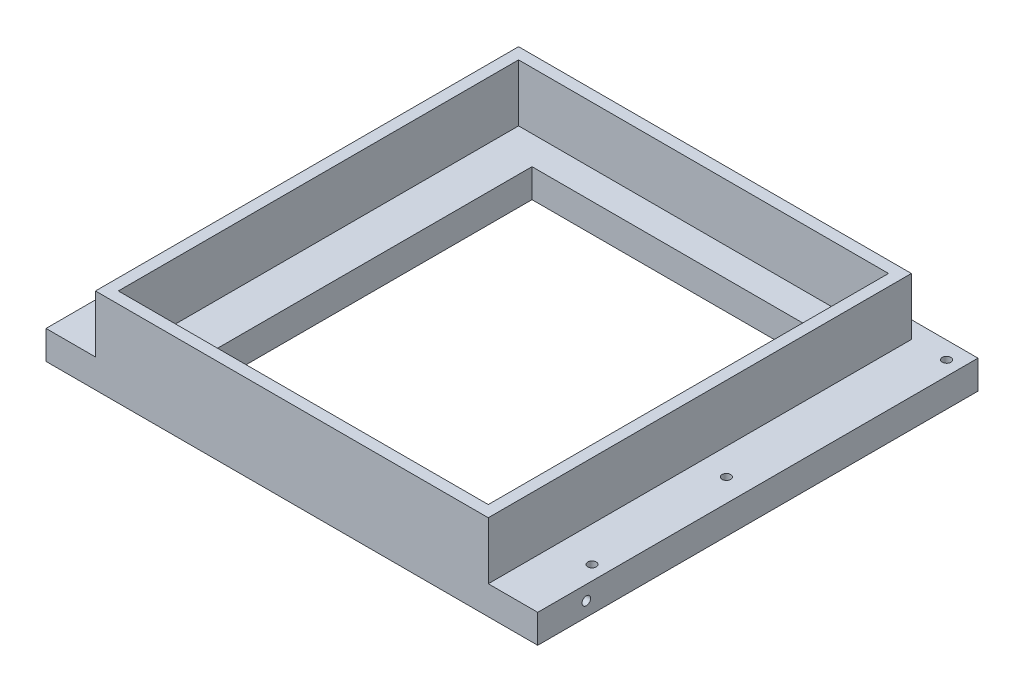
ISO-10303-21;
HEADER;
FILE_DESCRIPTION(('STEP AP214'),'2;1');
FILE_NAME('part.step','',(''),(''),'','','');
FILE_SCHEMA(('AUTOMOTIVE_DESIGN { 1 0 10303 214 1 1 1 1 }'));
ENDSEC;
DATA;
#1=APPLICATION_CONTEXT('core data for automotive mechanical design processes');
#2=APPLICATION_PROTOCOL_DEFINITION('international standard','automotive_design',2000,#1);
#3=PRODUCT_CONTEXT('',#1,'mechanical');
#4=PRODUCT('Part','Part','',(#3));
#5=PRODUCT_RELATED_PRODUCT_CATEGORY('part','',(#4));
#6=PRODUCT_DEFINITION_FORMATION('','',#4);
#7=PRODUCT_DEFINITION_CONTEXT('part definition',#1,'design');
#8=PRODUCT_DEFINITION('design','',#6,#7);
#9=PRODUCT_DEFINITION_SHAPE('','',#8);
#10=(LENGTH_UNIT() NAMED_UNIT(*) SI_UNIT(.MILLI.,.METRE.));
#11=(NAMED_UNIT(*) PLANE_ANGLE_UNIT() SI_UNIT($,.RADIAN.));
#12=(NAMED_UNIT(*) SI_UNIT($,.STERADIAN.) SOLID_ANGLE_UNIT());
#13=UNCERTAINTY_MEASURE_WITH_UNIT(LENGTH_MEASURE(1.E-05),#10,'distance_accuracy_value','');
#14=(GEOMETRIC_REPRESENTATION_CONTEXT(3) GLOBAL_UNCERTAINTY_ASSIGNED_CONTEXT((#13)) GLOBAL_UNIT_ASSIGNED_CONTEXT((#10,
#11,#12)) REPRESENTATION_CONTEXT('',''));
#15=CARTESIAN_POINT('',(0.,0.,0.));
#16=DIRECTION('',(0.,0.,1.));
#17=DIRECTION('',(1.,0.,0.));
#18=AXIS2_PLACEMENT_3D('',#15,#16,#17);
#19=CARTESIAN_POINT('',(0.,5.,0.));
#20=DIRECTION('',(0.,1.,0.));
#21=DIRECTION('',(0.,0.,1.));
#22=AXIS2_PLACEMENT_3D('',#19,#20,#21);
#23=PLANE('',#22);
#24=DIRECTION('',(-1.,0.,0.));
#25=VECTOR('',#24,1.);
#26=CARTESIAN_POINT('',(0.,5.,16.5));
#27=LINE('',#26,#25);
#28=CARTESIAN_POINT('',(43.,5.,16.5));
#29=VERTEX_POINT('',#28);
#30=CARTESIAN_POINT('',(34.35,5.,16.5));
#31=VERTEX_POINT('',#30);
#32=EDGE_CURVE('E322',#29,#31,#27,.T.);
#33=ORIENTED_EDGE('',*,*,#32,.F.);
#34=DIRECTION('',(0.,0.,1.));
#35=VECTOR('',#34,1.);
#36=CARTESIAN_POINT('',(43.,5.,0.));
#37=LINE('',#36,#35);
#38=CARTESIAN_POINT('',(43.,5.,-60.5));
#39=VERTEX_POINT('',#38);
#40=EDGE_CURVE('E140',#39,#29,#37,.T.);
#41=ORIENTED_EDGE('',*,*,#40,.F.);
#42=DIRECTION('',(1.,0.,0.));
#43=VECTOR('',#42,1.);
#44=CARTESIAN_POINT('',(-43.,5.,-60.5));
#45=LINE('',#44,#43);
#46=CARTESIAN_POINT('',(-43.,5.,-60.5));
#47=VERTEX_POINT('',#46);
#48=EDGE_CURVE('E309',#47,#39,#45,.T.);
#49=ORIENTED_EDGE('',*,*,#48,.F.);
#50=DIRECTION('',(0.,0.,1.));
#51=VECTOR('',#50,1.);
#52=CARTESIAN_POINT('',(-43.,5.,0.));
#53=LINE('',#52,#51);
#54=CARTESIAN_POINT('',(-43.,5.,16.5));
#55=VERTEX_POINT('',#54);
#56=EDGE_CURVE('E12',#47,#55,#53,.T.);
#57=ORIENTED_EDGE('',*,*,#56,.T.);
#58=CARTESIAN_POINT('',(-34.35,5.,16.5));
#59=VERTEX_POINT('',#58);
#60=EDGE_CURVE('E251',#59,#55,#27,.T.);
#61=ORIENTED_EDGE('',*,*,#60,.F.);
#62=DIRECTION('',(0.,0.,1.));
#63=VECTOR('',#62,1.);
#64=CARTESIAN_POINT('',(-34.35,5.,-57.5));
#65=LINE('',#64,#63);
#66=CARTESIAN_POINT('',(-34.35,5.,-57.5));
#67=VERTEX_POINT('',#66);
#68=EDGE_CURVE('E399',#67,#59,#65,.T.);
#69=ORIENTED_EDGE('',*,*,#68,.F.);
#70=DIRECTION('',(1.,0.,0.));
#71=VECTOR('',#70,1.);
#72=CARTESIAN_POINT('',(-34.35,5.,-57.5));
#73=LINE('',#72,#71);
#74=CARTESIAN_POINT('',(34.35,5.,-57.5));
#75=VERTEX_POINT('',#74);
#76=EDGE_CURVE('E409',#67,#75,#73,.T.);
#77=ORIENTED_EDGE('',*,*,#76,.T.);
#78=DIRECTION('',(0.,0.,1.));
#79=VECTOR('',#78,1.);
#80=CARTESIAN_POINT('',(34.35,5.,-57.5));
#81=LINE('',#80,#79);
#82=EDGE_CURVE('E418',#75,#31,#81,.T.);
#83=ORIENTED_EDGE('',*,*,#82,.T.);
#84=EDGE_LOOP('',(#33,#41,#49,#57,#61,#69,#77,#83));
#85=FACE_BOUND('',#84,.T.);
#86=CARTESIAN_POINT('',(-39.,5.,-20.5));
#87=DIRECTION('',(0.,1.,0.));
#88=DIRECTION('',(0.,0.,1.));
#89=AXIS2_PLACEMENT_3D('',#86,#87,#88);
#90=CIRCLE('',#89,0.750000000000013);
#91=CARTESIAN_POINT('',(-39.,5.,-19.75));
#92=VERTEX_POINT('',#91);
#93=EDGE_CURVE('E362',#92,#92,#90,.T.);
#94=ORIENTED_EDGE('',*,*,#93,.F.);
#95=EDGE_LOOP('',(#94));
#96=FACE_BOUND('',#95,.T.);
#97=CARTESIAN_POINT('',(40.5,5.,-57.5));
#98=DIRECTION('',(0.,1.,0.));
#99=DIRECTION('',(0.,0.,1.));
#100=AXIS2_PLACEMENT_3D('',#97,#98,#99);
#101=CIRCLE('',#100,0.749999999999999);
#102=CARTESIAN_POINT('',(40.5,5.,-56.75));
#103=VERTEX_POINT('',#102);
#104=EDGE_CURVE('E353',#103,#103,#101,.T.);
#105=ORIENTED_EDGE('',*,*,#104,.F.);
#106=EDGE_LOOP('',(#105));
#107=FACE_BOUND('',#106,.T.);
#108=CARTESIAN_POINT('',(40.5,5.,4.5));
#109=DIRECTION('',(0.,1.,0.));
#110=DIRECTION('',(0.,0.,1.));
#111=AXIS2_PLACEMENT_3D('',#108,#109,#110);
#112=CIRCLE('',#111,0.749999999999999);
#113=CARTESIAN_POINT('',(40.5,5.,5.25));
#114=VERTEX_POINT('',#113);
#115=EDGE_CURVE('E341',#114,#114,#112,.T.);
#116=ORIENTED_EDGE('',*,*,#115,.F.);
#117=EDGE_LOOP('',(#116));
#118=FACE_BOUND('',#117,.T.);
#119=CARTESIAN_POINT('',(-40.5,5.,4.5));
#120=DIRECTION('',(0.,1.,0.));
#121=DIRECTION('',(0.,0.,1.));
#122=AXIS2_PLACEMENT_3D('',#119,#120,#121);
#123=CIRCLE('',#122,0.749999999999999);
#124=CARTESIAN_POINT('',(-40.5,5.,5.25));
#125=VERTEX_POINT('',#124);
#126=EDGE_CURVE('E347',#125,#125,#123,.T.);
#127=ORIENTED_EDGE('',*,*,#126,.F.);
#128=EDGE_LOOP('',(#127));
#129=FACE_BOUND('',#128,.T.);
#130=CARTESIAN_POINT('',(39.,5.,-20.5));
#131=DIRECTION('',(0.,1.,0.));
#132=DIRECTION('',(0.,0.,1.));
#133=AXIS2_PLACEMENT_3D('',#130,#131,#132);
#134=CIRCLE('',#133,0.749999999999999);
#135=CARTESIAN_POINT('',(39.,5.,-19.75));
#136=VERTEX_POINT('',#135);
#137=EDGE_CURVE('E359',#136,#136,#134,.T.);
#138=ORIENTED_EDGE('',*,*,#137,.F.);
#139=EDGE_LOOP('',(#138));
#140=FACE_BOUND('',#139,.T.);
#141=CARTESIAN_POINT('',(-40.5,5.,-57.5));
#142=DIRECTION('',(0.,1.,0.));
#143=DIRECTION('',(0.,0.,1.));
#144=AXIS2_PLACEMENT_3D('',#141,#142,#143);
#145=CIRCLE('',#144,0.750000000000014);
#146=CARTESIAN_POINT('',(-40.5,5.,-56.75));
#147=VERTEX_POINT('',#146);
#148=EDGE_CURVE('E366',#147,#147,#145,.T.);
#149=ORIENTED_EDGE('',*,*,#148,.F.);
#150=EDGE_LOOP('',(#149));
#151=FACE_BOUND('',#150,.T.);
#152=ADVANCED_FACE('F131',(#85,#96,#107,#118,#129,#140,#151),#23,.T.);
#153=DIRECTION('',(0.,0.,-1.));
#154=VECTOR('',#153,1.);
#155=CARTESIAN_POINT('',(-32.35,5.,14.5));
#156=LINE('',#155,#154);
#157=CARTESIAN_POINT('',(-32.35,5.,14.5));
#158=VERTEX_POINT('',#157);
#159=CARTESIAN_POINT('',(-32.35,5.,-55.5));
#160=VERTEX_POINT('',#159);
#161=EDGE_CURVE('E156',#158,#160,#156,.T.);
#162=ORIENTED_EDGE('',*,*,#161,.F.);
#163=DIRECTION('',(-1.,0.,0.));
#164=VECTOR('',#163,1.);
#165=CARTESIAN_POINT('',(32.35,5.,14.5));
#166=LINE('',#165,#164);
#167=CARTESIAN_POINT('',(32.35,5.,14.5));
#168=VERTEX_POINT('',#167);
#169=EDGE_CURVE('E374',#168,#158,#166,.T.);
#170=ORIENTED_EDGE('',*,*,#169,.F.);
#171=DIRECTION('',(0.,0.,-1.));
#172=VECTOR('',#171,1.);
#173=CARTESIAN_POINT('',(32.35,5.,14.5));
#174=LINE('',#173,#172);
#175=CARTESIAN_POINT('',(32.35,5.,-55.5));
#176=VERTEX_POINT('',#175);
#177=EDGE_CURVE('E381',#168,#176,#174,.T.);
#178=ORIENTED_EDGE('',*,*,#177,.T.);
#179=DIRECTION('',(-1.,0.,0.));
#180=VECTOR('',#179,1.);
#181=CARTESIAN_POINT('',(32.35,5.,-55.5));
#182=LINE('',#181,#180);
#183=EDGE_CURVE('E392',#176,#160,#182,.T.);
#184=ORIENTED_EDGE('',*,*,#183,.T.);
#185=EDGE_LOOP('',(#162,#170,#178,#184));
#186=FACE_BOUND('',#185,.T.);
#187=DIRECTION('',(1.,0.,0.));
#188=VECTOR('',#187,1.);
#189=CARTESIAN_POINT('',(-25.,5.,4.5));
#190=LINE('',#189,#188);
#191=CARTESIAN_POINT('',(-25.,5.,4.5));
#192=VERTEX_POINT('',#191);
#193=CARTESIAN_POINT('',(25.,5.,4.5));
#194=VERTEX_POINT('',#193);
#195=EDGE_CURVE('E277',#192,#194,#190,.T.);
#196=ORIENTED_EDGE('',*,*,#195,.F.);
#197=DIRECTION('',(0.,0.,1.));
#198=VECTOR('',#197,1.);
#199=CARTESIAN_POINT('',(-25.,5.,-50.5));
#200=LINE('',#199,#198);
#201=CARTESIAN_POINT('',(-25.,5.,-50.5));
#202=VERTEX_POINT('',#201);
#203=EDGE_CURVE('E275',#202,#192,#200,.T.);
#204=ORIENTED_EDGE('',*,*,#203,.F.);
#205=DIRECTION('',(1.,0.,0.));
#206=VECTOR('',#205,1.);
#207=CARTESIAN_POINT('',(-25.,5.,-50.5));
#208=LINE('',#207,#206);
#209=CARTESIAN_POINT('',(25.,5.,-50.5));
#210=VERTEX_POINT('',#209);
#211=EDGE_CURVE('E283',#202,#210,#208,.T.);
#212=ORIENTED_EDGE('',*,*,#211,.T.);
#213=DIRECTION('',(0.,0.,1.));
#214=VECTOR('',#213,1.);
#215=CARTESIAN_POINT('',(25.,5.,-50.5));
#216=LINE('',#215,#214);
#217=EDGE_CURVE('E280',#210,#194,#216,.T.);
#218=ORIENTED_EDGE('',*,*,#217,.T.);
#219=EDGE_LOOP('',(#196,#204,#212,#218));
#220=FACE_BOUND('',#219,.T.);
#221=ADVANCED_FACE('F460',(#186,#220),#23,.T.);
#222=CARTESIAN_POINT('',(43.,5.,0.));
#223=DIRECTION('',(1.,0.,0.));
#224=DIRECTION('',(0.,0.,-1.));
#225=AXIS2_PLACEMENT_3D('',#222,#223,#224);
#226=PLANE('',#225);
#227=DIRECTION('',(0.,1.,0.));
#228=VECTOR('',#227,1.);
#229=CARTESIAN_POINT('',(43.,5.,16.5));
#230=LINE('',#229,#228);
#231=CARTESIAN_POINT('',(43.,0.,16.5));
#232=VERTEX_POINT('',#231);
#233=EDGE_CURVE('E319',#232,#29,#230,.T.);
#234=ORIENTED_EDGE('',*,*,#233,.F.);
#235=DIRECTION('',(0.,0.,1.));
#236=VECTOR('',#235,1.);
#237=CARTESIAN_POINT('',(43.,0.,0.));
#238=LINE('',#237,#236);
#239=CARTESIAN_POINT('',(43.,0.,-60.5));
#240=VERTEX_POINT('',#239);
#241=EDGE_CURVE('E263',#240,#232,#238,.T.);
#242=ORIENTED_EDGE('',*,*,#241,.F.);
#243=DIRECTION('',(0.,-1.,0.));
#244=VECTOR('',#243,1.);
#245=CARTESIAN_POINT('',(43.,5.,-60.5));
#246=LINE('',#245,#244);
#247=EDGE_CURVE('E135',#39,#240,#246,.T.);
#248=ORIENTED_EDGE('',*,*,#247,.F.);
#249=ORIENTED_EDGE('',*,*,#40,.T.);
#250=EDGE_LOOP('',(#234,#242,#248,#249));
#251=FACE_BOUND('',#250,.T.);
#252=CARTESIAN_POINT('',(43.,2.5,7.99999999999999));
#253=DIRECTION('',(1.,0.,0.));
#254=DIRECTION('',(0.,0.,-1.));
#255=AXIS2_PLACEMENT_3D('',#252,#253,#254);
#256=CIRCLE('',#255,0.75);
#257=CARTESIAN_POINT('',(43.,2.5,7.24999999999999));
#258=VERTEX_POINT('',#257);
#259=EDGE_CURVE('E254',#258,#258,#256,.T.);
#260=ORIENTED_EDGE('',*,*,#259,.F.);
#261=EDGE_LOOP('',(#260));
#262=FACE_BOUND('',#261,.T.);
#263=ADVANCED_FACE('F317',(#251,#262),#226,.T.);
#264=CARTESIAN_POINT('',(-43.,5.,0.));
#265=DIRECTION('',(1.,0.,0.));
#266=DIRECTION('',(0.,0.,-1.));
#267=AXIS2_PLACEMENT_3D('',#264,#265,#266);
#268=PLANE('',#267);
#269=CARTESIAN_POINT('',(-43.,2.5,8.00000000000001));
#270=DIRECTION('',(-1.,0.,0.));
#271=DIRECTION('',(0.,0.,1.));
#272=AXIS2_PLACEMENT_3D('',#269,#270,#271);
#273=CIRCLE('',#272,0.75);
#274=CARTESIAN_POINT('',(-43.,2.5,8.75000000000001));
#275=VERTEX_POINT('',#274);
#276=EDGE_CURVE('E332',#275,#275,#273,.T.);
#277=ORIENTED_EDGE('',*,*,#276,.F.);
#278=EDGE_LOOP('',(#277));
#279=FACE_BOUND('',#278,.T.);
#280=DIRECTION('',(0.,0.,1.));
#281=VECTOR('',#280,1.);
#282=CARTESIAN_POINT('',(-43.,0.,0.));
#283=LINE('',#282,#281);
#284=CARTESIAN_POINT('',(-43.,0.,-60.5));
#285=VERTEX_POINT('',#284);
#286=CARTESIAN_POINT('',(-43.,0.,16.5));
#287=VERTEX_POINT('',#286);
#288=EDGE_CURVE('E261',#285,#287,#283,.T.);
#289=ORIENTED_EDGE('',*,*,#288,.T.);
#290=DIRECTION('',(0.,1.,0.));
#291=VECTOR('',#290,1.);
#292=CARTESIAN_POINT('',(-43.,5.,16.5));
#293=LINE('',#292,#291);
#294=EDGE_CURVE('E245',#287,#55,#293,.T.);
#295=ORIENTED_EDGE('',*,*,#294,.T.);
#296=ORIENTED_EDGE('',*,*,#56,.F.);
#297=DIRECTION('',(0.,-1.,0.));
#298=VECTOR('',#297,1.);
#299=CARTESIAN_POINT('',(-43.,5.,-60.5));
#300=LINE('',#299,#298);
#301=EDGE_CURVE('E268',#47,#285,#300,.T.);
#302=ORIENTED_EDGE('',*,*,#301,.T.);
#303=EDGE_LOOP('',(#289,#295,#296,#302));
#304=FACE_BOUND('',#303,.T.);
#305=ADVANCED_FACE('F266',(#279,#304),#268,.F.);
#306=CARTESIAN_POINT('',(0.,0.,0.));
#307=DIRECTION('',(0.,1.,0.));
#308=DIRECTION('',(0.,0.,1.));
#309=AXIS2_PLACEMENT_3D('',#306,#307,#308);
#310=PLANE('',#309);
#311=CARTESIAN_POINT('',(-40.5,0.,-57.5));
#312=DIRECTION('',(0.,1.,0.));
#313=DIRECTION('',(0.,0.,1.));
#314=AXIS2_PLACEMENT_3D('',#311,#312,#313);
#315=CIRCLE('',#314,0.750000000000014);
#316=CARTESIAN_POINT('',(-40.5,0.,-56.75));
#317=VERTEX_POINT('',#316);
#318=EDGE_CURVE('E356',#317,#317,#315,.T.);
#319=ORIENTED_EDGE('',*,*,#318,.T.);
#320=EDGE_LOOP('',(#319));
#321=FACE_BOUND('',#320,.T.);
#322=CARTESIAN_POINT('',(39.,0.,-20.5));
#323=DIRECTION('',(0.,1.,0.));
#324=DIRECTION('',(0.,0.,1.));
#325=AXIS2_PLACEMENT_3D('',#322,#323,#324);
#326=CIRCLE('',#325,0.749999999999999);
#327=CARTESIAN_POINT('',(39.,0.,-19.75));
#328=VERTEX_POINT('',#327);
#329=EDGE_CURVE('E363',#328,#328,#326,.T.);
#330=ORIENTED_EDGE('',*,*,#329,.T.);
#331=EDGE_LOOP('',(#330));
#332=FACE_BOUND('',#331,.T.);
#333=CARTESIAN_POINT('',(-40.5,0.,4.5));
#334=DIRECTION('',(0.,1.,0.));
#335=DIRECTION('',(0.,0.,1.));
#336=AXIS2_PLACEMENT_3D('',#333,#334,#335);
#337=CIRCLE('',#336,0.749999999999999);
#338=CARTESIAN_POINT('',(-40.5,0.,5.25));
#339=VERTEX_POINT('',#338);
#340=EDGE_CURVE('E344',#339,#339,#337,.T.);
#341=ORIENTED_EDGE('',*,*,#340,.T.);
#342=EDGE_LOOP('',(#341));
#343=FACE_BOUND('',#342,.T.);
#344=CARTESIAN_POINT('',(40.5,0.,4.5));
#345=DIRECTION('',(0.,1.,0.));
#346=DIRECTION('',(0.,0.,1.));
#347=AXIS2_PLACEMENT_3D('',#344,#345,#346);
#348=CIRCLE('',#347,0.749999999999999);
#349=CARTESIAN_POINT('',(40.5,0.,5.25));
#350=VERTEX_POINT('',#349);
#351=EDGE_CURVE('E338',#350,#350,#348,.T.);
#352=ORIENTED_EDGE('',*,*,#351,.T.);
#353=EDGE_LOOP('',(#352));
#354=FACE_BOUND('',#353,.T.);
#355=CARTESIAN_POINT('',(40.5,0.,-57.5));
#356=DIRECTION('',(0.,1.,0.));
#357=DIRECTION('',(0.,0.,1.));
#358=AXIS2_PLACEMENT_3D('',#355,#356,#357);
#359=CIRCLE('',#358,0.749999999999999);
#360=CARTESIAN_POINT('',(40.5,0.,-56.75));
#361=VERTEX_POINT('',#360);
#362=EDGE_CURVE('E350',#361,#361,#359,.T.);
#363=ORIENTED_EDGE('',*,*,#362,.T.);
#364=EDGE_LOOP('',(#363));
#365=FACE_BOUND('',#364,.T.);
#366=CARTESIAN_POINT('',(-39.,0.,-20.5));
#367=DIRECTION('',(0.,1.,0.));
#368=DIRECTION('',(0.,0.,1.));
#369=AXIS2_PLACEMENT_3D('',#366,#367,#368);
#370=CIRCLE('',#369,0.750000000000013);
#371=CARTESIAN_POINT('',(-39.,0.,-19.75));
#372=VERTEX_POINT('',#371);
#373=EDGE_CURVE('E371',#372,#372,#370,.T.);
#374=ORIENTED_EDGE('',*,*,#373,.T.);
#375=EDGE_LOOP('',(#374));
#376=FACE_BOUND('',#375,.T.);
#377=ORIENTED_EDGE('',*,*,#241,.T.);
#378=DIRECTION('',(1.,0.,0.));
#379=VECTOR('',#378,1.);
#380=CARTESIAN_POINT('',(0.,0.,16.5));
#381=LINE('',#380,#379);
#382=EDGE_CURVE('E248',#287,#232,#381,.T.);
#383=ORIENTED_EDGE('',*,*,#382,.F.);
#384=ORIENTED_EDGE('',*,*,#288,.F.);
#385=DIRECTION('',(1.,0.,0.));
#386=VECTOR('',#385,1.);
#387=CARTESIAN_POINT('',(-43.,0.,-60.5));
#388=LINE('',#387,#386);
#389=EDGE_CURVE('E308',#285,#240,#388,.T.);
#390=ORIENTED_EDGE('',*,*,#389,.T.);
#391=EDGE_LOOP('',(#377,#383,#384,#390));
#392=FACE_BOUND('',#391,.T.);
#393=DIRECTION('',(0.,0.,1.));
#394=VECTOR('',#393,1.);
#395=CARTESIAN_POINT('',(-25.,0.,-50.5));
#396=LINE('',#395,#394);
#397=CARTESIAN_POINT('',(-25.,0.,-50.5));
#398=VERTEX_POINT('',#397);
#399=CARTESIAN_POINT('',(-25.,0.,4.5));
#400=VERTEX_POINT('',#399);
#401=EDGE_CURVE('E287',#398,#400,#396,.T.);
#402=ORIENTED_EDGE('',*,*,#401,.T.);
#403=DIRECTION('',(1.,0.,0.));
#404=VECTOR('',#403,1.);
#405=CARTESIAN_POINT('',(-25.,0.,4.5));
#406=LINE('',#405,#404);
#407=CARTESIAN_POINT('',(25.,0.,4.5));
#408=VERTEX_POINT('',#407);
#409=EDGE_CURVE('E290',#400,#408,#406,.T.);
#410=ORIENTED_EDGE('',*,*,#409,.T.);
#411=DIRECTION('',(0.,0.,1.));
#412=VECTOR('',#411,1.);
#413=CARTESIAN_POINT('',(25.,0.,-50.5));
#414=LINE('',#413,#412);
#415=CARTESIAN_POINT('',(25.,0.,-50.5));
#416=VERTEX_POINT('',#415);
#417=EDGE_CURVE('E294',#416,#408,#414,.T.);
#418=ORIENTED_EDGE('',*,*,#417,.F.);
#419=DIRECTION('',(1.,0.,0.));
#420=VECTOR('',#419,1.);
#421=CARTESIAN_POINT('',(-25.,0.,-50.5));
#422=LINE('',#421,#420);
#423=EDGE_CURVE('E278',#398,#416,#422,.T.);
#424=ORIENTED_EDGE('',*,*,#423,.F.);
#425=EDGE_LOOP('',(#402,#410,#418,#424));
#426=FACE_BOUND('',#425,.T.);
#427=ADVANCED_FACE('F258',(#321,#332,#343,#354,#365,#376,#392,#426),#310,.F.);
#428=CARTESIAN_POINT('',(25.,5.,-50.5));
#429=DIRECTION('',(1.,0.,0.));
#430=DIRECTION('',(0.,0.,-1.));
#431=AXIS2_PLACEMENT_3D('',#428,#429,#430);
#432=PLANE('',#431);
#433=ORIENTED_EDGE('',*,*,#417,.T.);
#434=DIRECTION('',(0.,-1.,0.));
#435=VECTOR('',#434,1.);
#436=CARTESIAN_POINT('',(25.,5.,4.5));
#437=LINE('',#436,#435);
#438=EDGE_CURVE('E303',#194,#408,#437,.T.);
#439=ORIENTED_EDGE('',*,*,#438,.F.);
#440=ORIENTED_EDGE('',*,*,#217,.F.);
#441=DIRECTION('',(0.,-1.,0.));
#442=VECTOR('',#441,1.);
#443=CARTESIAN_POINT('',(25.,5.,-50.5));
#444=LINE('',#443,#442);
#445=EDGE_CURVE('E301',#210,#416,#444,.T.);
#446=ORIENTED_EDGE('',*,*,#445,.T.);
#447=EDGE_LOOP('',(#433,#439,#440,#446));
#448=FACE_BOUND('',#447,.T.);
#449=ADVANCED_FACE('F471',(#448),#432,.F.);
#450=CARTESIAN_POINT('',(-25.,5.,-50.5));
#451=DIRECTION('',(0.,0.,-1.));
#452=DIRECTION('',(-1.,0.,0.));
#453=AXIS2_PLACEMENT_3D('',#450,#451,#452);
#454=PLANE('',#453);
#455=ORIENTED_EDGE('',*,*,#423,.T.);
#456=ORIENTED_EDGE('',*,*,#445,.F.);
#457=ORIENTED_EDGE('',*,*,#211,.F.);
#458=DIRECTION('',(0.,-1.,0.));
#459=VECTOR('',#458,1.);
#460=CARTESIAN_POINT('',(-25.,5.,-50.5));
#461=LINE('',#460,#459);
#462=EDGE_CURVE('E286',#202,#398,#461,.T.);
#463=ORIENTED_EDGE('',*,*,#462,.T.);
#464=EDGE_LOOP('',(#455,#456,#457,#463));
#465=FACE_BOUND('',#464,.T.);
#466=ADVANCED_FACE('F479',(#465),#454,.F.);
#467=CARTESIAN_POINT('',(-25.,5.,-50.5));
#468=DIRECTION('',(1.,0.,0.));
#469=DIRECTION('',(0.,0.,-1.));
#470=AXIS2_PLACEMENT_3D('',#467,#468,#469);
#471=PLANE('',#470);
#472=ORIENTED_EDGE('',*,*,#401,.F.);
#473=ORIENTED_EDGE('',*,*,#462,.F.);
#474=ORIENTED_EDGE('',*,*,#203,.T.);
#475=DIRECTION('',(0.,-1.,0.));
#476=VECTOR('',#475,1.);
#477=CARTESIAN_POINT('',(-25.,5.,4.5));
#478=LINE('',#477,#476);
#479=EDGE_CURVE('E305',#192,#400,#478,.T.);
#480=ORIENTED_EDGE('',*,*,#479,.T.);
#481=EDGE_LOOP('',(#472,#473,#474,#480));
#482=FACE_BOUND('',#481,.T.);
#483=ADVANCED_FACE('F476',(#482),#471,.T.);
#484=CARTESIAN_POINT('',(-25.,5.,4.5));
#485=DIRECTION('',(0.,0.,-1.));
#486=DIRECTION('',(-1.,0.,0.));
#487=AXIS2_PLACEMENT_3D('',#484,#485,#486);
#488=PLANE('',#487);
#489=ORIENTED_EDGE('',*,*,#409,.F.);
#490=ORIENTED_EDGE('',*,*,#479,.F.);
#491=ORIENTED_EDGE('',*,*,#195,.T.);
#492=ORIENTED_EDGE('',*,*,#438,.T.);
#493=EDGE_LOOP('',(#489,#490,#491,#492));
#494=FACE_BOUND('',#493,.T.);
#495=ADVANCED_FACE('F469',(#494),#488,.T.);
#496=CARTESIAN_POINT('',(-43.,5.,-60.5));
#497=DIRECTION('',(0.,0.,-1.));
#498=DIRECTION('',(-1.,0.,0.));
#499=AXIS2_PLACEMENT_3D('',#496,#497,#498);
#500=PLANE('',#499);
#501=ORIENTED_EDGE('',*,*,#389,.F.);
#502=ORIENTED_EDGE('',*,*,#301,.F.);
#503=ORIENTED_EDGE('',*,*,#48,.T.);
#504=ORIENTED_EDGE('',*,*,#247,.T.);
#505=EDGE_LOOP('',(#501,#502,#503,#504));
#506=FACE_BOUND('',#505,.T.);
#507=ADVANCED_FACE('F133',(#506),#500,.T.);
#508=CARTESIAN_POINT('',(-34.35,15.,-57.5));
#509=DIRECTION('',(1.,0.,0.));
#510=DIRECTION('',(0.,0.,-1.));
#511=AXIS2_PLACEMENT_3D('',#508,#509,#510);
#512=PLANE('',#511);
#513=ORIENTED_EDGE('',*,*,#68,.T.);
#514=DIRECTION('',(0.,1.,0.));
#515=VECTOR('',#514,1.);
#516=CARTESIAN_POINT('',(-34.35,15.,16.5));
#517=LINE('',#516,#515);
#518=CARTESIAN_POINT('',(-34.35,15.,16.5));
#519=VERTEX_POINT('',#518);
#520=EDGE_CURVE('E321',#59,#519,#517,.T.);
#521=ORIENTED_EDGE('',*,*,#520,.T.);
#522=DIRECTION('',(0.,0.,1.));
#523=VECTOR('',#522,1.);
#524=CARTESIAN_POINT('',(-34.35,15.,-57.5));
#525=LINE('',#524,#523);
#526=CARTESIAN_POINT('',(-34.35,15.,-57.5));
#527=VERTEX_POINT('',#526);
#528=EDGE_CURVE('E405',#527,#519,#525,.T.);
#529=ORIENTED_EDGE('',*,*,#528,.F.);
#530=DIRECTION('',(0.,-1.,0.));
#531=VECTOR('',#530,1.);
#532=CARTESIAN_POINT('',(-34.35,15.,-57.5));
#533=LINE('',#532,#531);
#534=EDGE_CURVE('E415',#527,#67,#533,.T.);
#535=ORIENTED_EDGE('',*,*,#534,.T.);
#536=EDGE_LOOP('',(#513,#521,#529,#535));
#537=FACE_BOUND('',#536,.T.);
#538=ADVANCED_FACE('F437',(#537),#512,.F.);
#539=CARTESIAN_POINT('',(34.35,15.,-57.5));
#540=DIRECTION('',(1.,0.,0.));
#541=DIRECTION('',(0.,0.,-1.));
#542=AXIS2_PLACEMENT_3D('',#539,#540,#541);
#543=PLANE('',#542);
#544=DIRECTION('',(0.,1.,0.));
#545=VECTOR('',#544,1.);
#546=CARTESIAN_POINT('',(34.35,15.,16.5));
#547=LINE('',#546,#545);
#548=CARTESIAN_POINT('',(34.35,15.,16.5));
#549=VERTEX_POINT('',#548);
#550=EDGE_CURVE('E148',#31,#549,#547,.T.);
#551=ORIENTED_EDGE('',*,*,#550,.F.);
#552=ORIENTED_EDGE('',*,*,#82,.F.);
#553=DIRECTION('',(0.,-1.,0.));
#554=VECTOR('',#553,1.);
#555=CARTESIAN_POINT('',(34.35,15.,-57.5));
#556=LINE('',#555,#554);
#557=CARTESIAN_POINT('',(34.35,15.,-57.5));
#558=VERTEX_POINT('',#557);
#559=EDGE_CURVE('E291',#558,#75,#556,.T.);
#560=ORIENTED_EDGE('',*,*,#559,.F.);
#561=DIRECTION('',(0.,0.,1.));
#562=VECTOR('',#561,1.);
#563=CARTESIAN_POINT('',(34.35,15.,-57.5));
#564=LINE('',#563,#562);
#565=EDGE_CURVE('E408',#558,#549,#564,.T.);
#566=ORIENTED_EDGE('',*,*,#565,.T.);
#567=EDGE_LOOP('',(#551,#552,#560,#566));
#568=FACE_BOUND('',#567,.T.);
#569=ADVANCED_FACE('F432',(#568),#543,.T.);
#570=CARTESIAN_POINT('',(-34.35,15.,-57.5));
#571=DIRECTION('',(0.,0.,-1.));
#572=DIRECTION('',(-1.,0.,0.));
#573=AXIS2_PLACEMENT_3D('',#570,#571,#572);
#574=PLANE('',#573);
#575=ORIENTED_EDGE('',*,*,#76,.F.);
#576=ORIENTED_EDGE('',*,*,#534,.F.);
#577=DIRECTION('',(1.,0.,0.));
#578=VECTOR('',#577,1.);
#579=CARTESIAN_POINT('',(-34.35,15.,-57.5));
#580=LINE('',#579,#578);
#581=EDGE_CURVE('E412',#527,#558,#580,.T.);
#582=ORIENTED_EDGE('',*,*,#581,.T.);
#583=ORIENTED_EDGE('',*,*,#559,.T.);
#584=EDGE_LOOP('',(#575,#576,#582,#583));
#585=FACE_BOUND('',#584,.T.);
#586=ADVANCED_FACE('F428',(#585),#574,.T.);
#587=CARTESIAN_POINT('',(0.,15.,0.));
#588=DIRECTION('',(0.,1.,0.));
#589=DIRECTION('',(0.,0.,1.));
#590=AXIS2_PLACEMENT_3D('',#587,#588,#589);
#591=PLANE('',#590);
#592=DIRECTION('',(1.,0.,0.));
#593=VECTOR('',#592,1.);
#594=CARTESIAN_POINT('',(0.,15.,16.5));
#595=LINE('',#594,#593);
#596=EDGE_CURVE('E264',#519,#549,#595,.T.);
#597=ORIENTED_EDGE('',*,*,#596,.T.);
#598=ORIENTED_EDGE('',*,*,#565,.F.);
#599=ORIENTED_EDGE('',*,*,#581,.F.);
#600=ORIENTED_EDGE('',*,*,#528,.T.);
#601=EDGE_LOOP('',(#597,#598,#599,#600));
#602=FACE_BOUND('',#601,.T.);
#603=DIRECTION('',(-1.,0.,0.));
#604=VECTOR('',#603,1.);
#605=CARTESIAN_POINT('',(32.35,15.,14.5));
#606=LINE('',#605,#604);
#607=CARTESIAN_POINT('',(32.35,15.,14.5));
#608=VERTEX_POINT('',#607);
#609=CARTESIAN_POINT('',(-32.35,15.,14.5));
#610=VERTEX_POINT('',#609);
#611=EDGE_CURVE('E377',#608,#610,#606,.T.);
#612=ORIENTED_EDGE('',*,*,#611,.T.);
#613=DIRECTION('',(0.,0.,-1.));
#614=VECTOR('',#613,1.);
#615=CARTESIAN_POINT('',(-32.35,15.,14.5));
#616=LINE('',#615,#614);
#617=CARTESIAN_POINT('',(-32.35,15.,-55.5));
#618=VERTEX_POINT('',#617);
#619=EDGE_CURVE('E380',#610,#618,#616,.T.);
#620=ORIENTED_EDGE('',*,*,#619,.T.);
#621=DIRECTION('',(-1.,0.,0.));
#622=VECTOR('',#621,1.);
#623=CARTESIAN_POINT('',(32.35,15.,-55.5));
#624=LINE('',#623,#622);
#625=CARTESIAN_POINT('',(32.35,15.,-55.5));
#626=VERTEX_POINT('',#625);
#627=EDGE_CURVE('E384',#626,#618,#624,.T.);
#628=ORIENTED_EDGE('',*,*,#627,.F.);
#629=DIRECTION('',(0.,0.,-1.));
#630=VECTOR('',#629,1.);
#631=CARTESIAN_POINT('',(32.35,15.,14.5));
#632=LINE('',#631,#630);
#633=EDGE_CURVE('E387',#608,#626,#632,.T.);
#634=ORIENTED_EDGE('',*,*,#633,.F.);
#635=EDGE_LOOP('',(#612,#620,#628,#634));
#636=FACE_BOUND('',#635,.T.);
#637=ADVANCED_FACE('F439',(#602,#636),#591,.T.);
#638=CARTESIAN_POINT('',(32.35,15.,14.5));
#639=DIRECTION('',(0.,0.,1.));
#640=DIRECTION('',(1.,0.,0.));
#641=AXIS2_PLACEMENT_3D('',#638,#639,#640);
#642=PLANE('',#641);
#643=ORIENTED_EDGE('',*,*,#169,.T.);
#644=DIRECTION('',(0.,-1.,0.));
#645=VECTOR('',#644,1.);
#646=CARTESIAN_POINT('',(-32.35,15.,14.5));
#647=LINE('',#646,#645);
#648=EDGE_CURVE('E389',#610,#158,#647,.T.);
#649=ORIENTED_EDGE('',*,*,#648,.F.);
#650=ORIENTED_EDGE('',*,*,#611,.F.);
#651=DIRECTION('',(0.,-1.,0.));
#652=VECTOR('',#651,1.);
#653=CARTESIAN_POINT('',(32.35,15.,14.5));
#654=LINE('',#653,#652);
#655=EDGE_CURVE('E397',#608,#168,#654,.T.);
#656=ORIENTED_EDGE('',*,*,#655,.T.);
#657=EDGE_LOOP('',(#643,#649,#650,#656));
#658=FACE_BOUND('',#657,.T.);
#659=ADVANCED_FACE('F443',(#658),#642,.F.);
#660=CARTESIAN_POINT('',(32.35,15.,14.5));
#661=DIRECTION('',(-1.,0.,0.));
#662=DIRECTION('',(0.,0.,1.));
#663=AXIS2_PLACEMENT_3D('',#660,#661,#662);
#664=PLANE('',#663);
#665=ORIENTED_EDGE('',*,*,#177,.F.);
#666=ORIENTED_EDGE('',*,*,#655,.F.);
#667=ORIENTED_EDGE('',*,*,#633,.T.);
#668=DIRECTION('',(0.,-1.,0.));
#669=VECTOR('',#668,1.);
#670=CARTESIAN_POINT('',(32.35,15.,-55.5));
#671=LINE('',#670,#669);
#672=EDGE_CURVE('E400',#626,#176,#671,.T.);
#673=ORIENTED_EDGE('',*,*,#672,.T.);
#674=EDGE_LOOP('',(#665,#666,#667,#673));
#675=FACE_BOUND('',#674,.T.);
#676=ADVANCED_FACE('F458',(#675),#664,.T.);
#677=CARTESIAN_POINT('',(32.35,15.,-55.5));
#678=DIRECTION('',(0.,0.,1.));
#679=DIRECTION('',(1.,0.,0.));
#680=AXIS2_PLACEMENT_3D('',#677,#678,#679);
#681=PLANE('',#680);
#682=ORIENTED_EDGE('',*,*,#183,.F.);
#683=ORIENTED_EDGE('',*,*,#672,.F.);
#684=ORIENTED_EDGE('',*,*,#627,.T.);
#685=DIRECTION('',(0.,-1.,0.));
#686=VECTOR('',#685,1.);
#687=CARTESIAN_POINT('',(-32.35,15.,-55.5));
#688=LINE('',#687,#686);
#689=EDGE_CURVE('E402',#618,#160,#688,.T.);
#690=ORIENTED_EDGE('',*,*,#689,.T.);
#691=EDGE_LOOP('',(#682,#683,#684,#690));
#692=FACE_BOUND('',#691,.T.);
#693=ADVANCED_FACE('F456',(#692),#681,.T.);
#694=CARTESIAN_POINT('',(-32.35,15.,14.5));
#695=DIRECTION('',(-1.,0.,0.));
#696=DIRECTION('',(0.,0.,1.));
#697=AXIS2_PLACEMENT_3D('',#694,#695,#696);
#698=PLANE('',#697);
#699=ORIENTED_EDGE('',*,*,#161,.T.);
#700=ORIENTED_EDGE('',*,*,#689,.F.);
#701=ORIENTED_EDGE('',*,*,#619,.F.);
#702=ORIENTED_EDGE('',*,*,#648,.T.);
#703=EDGE_LOOP('',(#699,#700,#701,#702));
#704=FACE_BOUND('',#703,.T.);
#705=ADVANCED_FACE('F452',(#704),#698,.F.);
#706=CARTESIAN_POINT('',(-39.,0.,-20.5));
#707=DIRECTION('',(0.,1.,0.));
#708=DIRECTION('',(0.,0.,1.));
#709=AXIS2_PLACEMENT_3D('',#706,#707,#708);
#710=CYLINDRICAL_SURFACE('',#709,0.750000000000013);
#711=ORIENTED_EDGE('',*,*,#373,.F.);
#712=EDGE_LOOP('',(#711));
#713=FACE_BOUND('',#712,.T.);
#714=ORIENTED_EDGE('',*,*,#93,.T.);
#715=EDGE_LOOP('',(#714));
#716=FACE_BOUND('',#715,.T.);
#717=ADVANCED_FACE('F535',(#713,#716),#710,.F.);
#718=CARTESIAN_POINT('',(40.5,0.,-57.5));
#719=DIRECTION('',(0.,1.,0.));
#720=DIRECTION('',(0.,0.,1.));
#721=AXIS2_PLACEMENT_3D('',#718,#719,#720);
#722=CYLINDRICAL_SURFACE('',#721,0.749999999999999);
#723=ORIENTED_EDGE('',*,*,#362,.F.);
#724=EDGE_LOOP('',(#723));
#725=FACE_BOUND('',#724,.T.);
#726=ORIENTED_EDGE('',*,*,#104,.T.);
#727=EDGE_LOOP('',(#726));
#728=FACE_BOUND('',#727,.T.);
#729=ADVANCED_FACE('F528',(#725,#728),#722,.F.);
#730=CARTESIAN_POINT('',(40.5,0.,4.5));
#731=DIRECTION('',(0.,1.,0.));
#732=DIRECTION('',(0.,0.,1.));
#733=AXIS2_PLACEMENT_3D('',#730,#731,#732);
#734=CYLINDRICAL_SURFACE('',#733,0.749999999999999);
#735=ORIENTED_EDGE('',*,*,#351,.F.);
#736=EDGE_LOOP('',(#735));
#737=FACE_BOUND('',#736,.T.);
#738=ORIENTED_EDGE('',*,*,#115,.T.);
#739=EDGE_LOOP('',(#738));
#740=FACE_BOUND('',#739,.T.);
#741=ADVANCED_FACE('F524',(#737,#740),#734,.F.);
#742=CARTESIAN_POINT('',(-40.5,0.,4.5));
#743=DIRECTION('',(0.,1.,0.));
#744=DIRECTION('',(0.,0.,1.));
#745=AXIS2_PLACEMENT_3D('',#742,#743,#744);
#746=CYLINDRICAL_SURFACE('',#745,0.749999999999999);
#747=ORIENTED_EDGE('',*,*,#340,.F.);
#748=EDGE_LOOP('',(#747));
#749=FACE_BOUND('',#748,.T.);
#750=ORIENTED_EDGE('',*,*,#126,.T.);
#751=EDGE_LOOP('',(#750));
#752=FACE_BOUND('',#751,.T.);
#753=ADVANCED_FACE('F527',(#749,#752),#746,.F.);
#754=CARTESIAN_POINT('',(39.,0.,-20.5));
#755=DIRECTION('',(0.,1.,0.));
#756=DIRECTION('',(0.,0.,1.));
#757=AXIS2_PLACEMENT_3D('',#754,#755,#756);
#758=CYLINDRICAL_SURFACE('',#757,0.749999999999999);
#759=ORIENTED_EDGE('',*,*,#329,.F.);
#760=EDGE_LOOP('',(#759));
#761=FACE_BOUND('',#760,.T.);
#762=ORIENTED_EDGE('',*,*,#137,.T.);
#763=EDGE_LOOP('',(#762));
#764=FACE_BOUND('',#763,.T.);
#765=ADVANCED_FACE('F518',(#761,#764),#758,.F.);
#766=CARTESIAN_POINT('',(-40.5,0.,-57.5));
#767=DIRECTION('',(0.,1.,0.));
#768=DIRECTION('',(0.,0.,1.));
#769=AXIS2_PLACEMENT_3D('',#766,#767,#768);
#770=CYLINDRICAL_SURFACE('',#769,0.750000000000014);
#771=ORIENTED_EDGE('',*,*,#318,.F.);
#772=EDGE_LOOP('',(#771));
#773=FACE_BOUND('',#772,.T.);
#774=ORIENTED_EDGE('',*,*,#148,.T.);
#775=EDGE_LOOP('',(#774));
#776=FACE_BOUND('',#775,.T.);
#777=ADVANCED_FACE('F508',(#773,#776),#770,.F.);
#778=CARTESIAN_POINT('',(-41.,2.5,8.00000000000001));
#779=DIRECTION('',(-1.,0.,0.));
#780=DIRECTION('',(0.,0.,1.));
#781=AXIS2_PLACEMENT_3D('',#778,#779,#780);
#782=CYLINDRICAL_SURFACE('',#781,0.75);
#783=CARTESIAN_POINT('',(-41.,2.5,8.00000000000001));
#784=DIRECTION('',(-1.,0.,0.));
#785=DIRECTION('',(0.,0.,1.));
#786=AXIS2_PLACEMENT_3D('',#783,#784,#785);
#787=CIRCLE('',#786,0.75);
#788=CARTESIAN_POINT('',(-41.,2.5,8.75000000000001));
#789=VERTEX_POINT('',#788);
#790=EDGE_CURVE('E335',#789,#789,#787,.T.);
#791=ORIENTED_EDGE('',*,*,#790,.F.);
#792=EDGE_LOOP('',(#791));
#793=FACE_BOUND('',#792,.T.);
#794=ORIENTED_EDGE('',*,*,#276,.T.);
#795=EDGE_LOOP('',(#794));
#796=FACE_BOUND('',#795,.T.);
#797=ADVANCED_FACE('F505',(#793,#796),#782,.F.);
#798=CARTESIAN_POINT('',(-41.,2.5,8.00000000000001));
#799=DIRECTION('',(-1.,0.,0.));
#800=DIRECTION('',(0.,0.,1.));
#801=AXIS2_PLACEMENT_3D('',#798,#799,#800);
#802=PLANE('',#801);
#803=ORIENTED_EDGE('',*,*,#790,.T.);
#804=EDGE_LOOP('',(#803));
#805=FACE_BOUND('',#804,.T.);
#806=ADVANCED_FACE('F507',(#805),#802,.T.);
#807=CARTESIAN_POINT('',(41.,2.5,7.99999999999999));
#808=DIRECTION('',(1.,0.,0.));
#809=DIRECTION('',(0.,0.,-1.));
#810=AXIS2_PLACEMENT_3D('',#807,#808,#809);
#811=CYLINDRICAL_SURFACE('',#810,0.75);
#812=CARTESIAN_POINT('',(41.,2.5,7.99999999999999));
#813=DIRECTION('',(1.,0.,0.));
#814=DIRECTION('',(0.,0.,-1.));
#815=AXIS2_PLACEMENT_3D('',#812,#813,#814);
#816=CIRCLE('',#815,0.75);
#817=CARTESIAN_POINT('',(41.,2.5,7.24999999999999));
#818=VERTEX_POINT('',#817);
#819=EDGE_CURVE('E329',#818,#818,#816,.T.);
#820=ORIENTED_EDGE('',*,*,#819,.F.);
#821=EDGE_LOOP('',(#820));
#822=FACE_BOUND('',#821,.T.);
#823=ORIENTED_EDGE('',*,*,#259,.T.);
#824=EDGE_LOOP('',(#823));
#825=FACE_BOUND('',#824,.T.);
#826=ADVANCED_FACE('F514',(#822,#825),#811,.F.);
#827=CARTESIAN_POINT('',(41.,2.5,7.99999999999999));
#828=DIRECTION('',(1.,0.,0.));
#829=DIRECTION('',(0.,0.,-1.));
#830=AXIS2_PLACEMENT_3D('',#827,#828,#829);
#831=PLANE('',#830);
#832=ORIENTED_EDGE('',*,*,#819,.T.);
#833=EDGE_LOOP('',(#832));
#834=FACE_BOUND('',#833,.T.);
#835=ADVANCED_FACE('F694',(#834),#831,.T.);
#836=CARTESIAN_POINT('',(0.,15.,16.5));
#837=DIRECTION('',(0.,0.,-1.));
#838=DIRECTION('',(-1.,0.,0.));
#839=AXIS2_PLACEMENT_3D('',#836,#837,#838);
#840=PLANE('',#839);
#841=ORIENTED_EDGE('',*,*,#382,.T.);
#842=ORIENTED_EDGE('',*,*,#233,.T.);
#843=ORIENTED_EDGE('',*,*,#32,.T.);
#844=ORIENTED_EDGE('',*,*,#550,.T.);
#845=ORIENTED_EDGE('',*,*,#596,.F.);
#846=ORIENTED_EDGE('',*,*,#520,.F.);
#847=ORIENTED_EDGE('',*,*,#60,.T.);
#848=ORIENTED_EDGE('',*,*,#294,.F.);
#849=EDGE_LOOP('',(#841,#842,#843,#844,#845,#846,#847,#848));
#850=FACE_BOUND('',#849,.T.);
#851=ADVANCED_FACE('F247',(#850),#840,.F.);
#852=CLOSED_SHELL('',(#152,#221,#263,#305,#427,#449,#466,#483,#495,#507,#538,#569,#586,#637,
#659,#676,#693,#705,#717,#729,#741,#753,#765,#777,#797,#806,#826,#835,#851));
#853=MANIFOLD_SOLID_BREP('B2',#852);
#854=ADVANCED_BREP_SHAPE_REPRESENTATION('',(#18,#853),#14);
#855=SHAPE_DEFINITION_REPRESENTATION(#9,#854);
ENDSEC;
END-ISO-10303-21;
